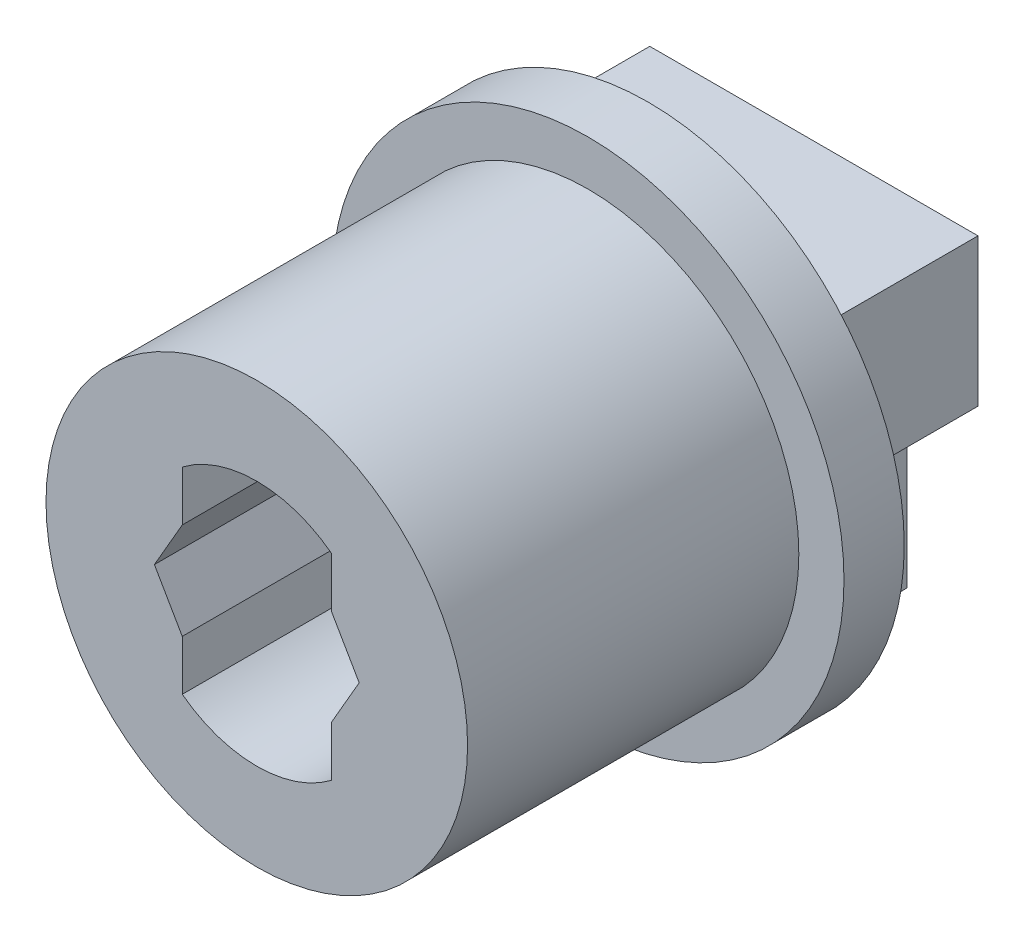
ISO-10303-21;
HEADER;
FILE_DESCRIPTION(('STEP AP214'),'2;1');
FILE_NAME('part.step','',(''),(''),'','','');
FILE_SCHEMA(('AUTOMOTIVE_DESIGN { 1 0 10303 214 1 1 1 1 }'));
ENDSEC;
DATA;
#1=APPLICATION_CONTEXT('core data for automotive mechanical design processes');
#2=APPLICATION_PROTOCOL_DEFINITION('international standard','automotive_design',2000,#1);
#3=PRODUCT_CONTEXT('',#1,'mechanical');
#4=PRODUCT('Part','Part','',(#3));
#5=PRODUCT_RELATED_PRODUCT_CATEGORY('part','',(#4));
#6=PRODUCT_DEFINITION_FORMATION('','',#4);
#7=PRODUCT_DEFINITION_CONTEXT('part definition',#1,'design');
#8=PRODUCT_DEFINITION('design','',#6,#7);
#9=PRODUCT_DEFINITION_SHAPE('','',#8);
#10=(LENGTH_UNIT() NAMED_UNIT(*) SI_UNIT(.MILLI.,.METRE.));
#11=(NAMED_UNIT(*) PLANE_ANGLE_UNIT() SI_UNIT($,.RADIAN.));
#12=(NAMED_UNIT(*) SI_UNIT($,.STERADIAN.) SOLID_ANGLE_UNIT());
#13=UNCERTAINTY_MEASURE_WITH_UNIT(LENGTH_MEASURE(1.E-05),#10,'distance_accuracy_value','');
#14=(GEOMETRIC_REPRESENTATION_CONTEXT(3) GLOBAL_UNCERTAINTY_ASSIGNED_CONTEXT((#13)) GLOBAL_UNIT_ASSIGNED_CONTEXT((#10,
#11,#12)) REPRESENTATION_CONTEXT('',''));
#15=CARTESIAN_POINT('',(0.,0.,0.));
#16=DIRECTION('',(0.,0.,1.));
#17=DIRECTION('',(1.,0.,0.));
#18=AXIS2_PLACEMENT_3D('',#15,#16,#17);
#19=CARTESIAN_POINT('',(-14.5592,-4.1492,0.));
#20=DIRECTION('',(0.,0.,-1.));
#21=DIRECTION('',(-1.,0.,0.));
#22=AXIS2_PLACEMENT_3D('',#19,#20,#21);
#23=PLANE('',#22);
#24=CARTESIAN_POINT('',(-18.,0.,0.));
#25=DIRECTION('',(0.,0.,1.));
#26=DIRECTION('',(1.,0.,0.));
#27=AXIS2_PLACEMENT_3D('',#24,#25,#26);
#28=CIRCLE('',#27,8.5);
#29=CARTESIAN_POINT('',(-9.5,0.,0.));
#30=VERTEX_POINT('',#29);
#31=EDGE_CURVE('E309',#30,#30,#28,.T.);
#32=ORIENTED_EDGE('',*,*,#31,.T.);
#33=EDGE_LOOP('',(#32));
#34=FACE_BOUND('',#33,.T.);
#35=CARTESIAN_POINT('',(-17.9999999993386,-1.27777996516976E-10,0.));
#36=DIRECTION('',(0.,0.,-1.));
#37=DIRECTION('',(-1.,0.,0.));
#38=AXIS2_PLACEMENT_3D('',#35,#36,#37);
#39=CIRCLE('',#38,7.00000000066145);
#40=CARTESIAN_POINT('',(-25.,-1.27777996516976E-10,0.));
#41=VERTEX_POINT('',#40);
#42=EDGE_CURVE('E11',#41,#41,#39,.F.);
#43=ORIENTED_EDGE('',*,*,#42,.F.);
#44=EDGE_LOOP('',(#43));
#45=FACE_BOUND('',#44,.T.);
#46=ADVANCED_FACE('F36',(#34,#45),#23,.F.);
#47=CARTESIAN_POINT('',(-9.398,-8.602,-2.));
#48=DIRECTION('',(0.,0.,-1.));
#49=DIRECTION('',(-1.,0.,0.));
#50=AXIS2_PLACEMENT_3D('',#47,#48,#49);
#51=PLANE('',#50);
#52=CARTESIAN_POINT('',(-18.,0.,-2.));
#53=DIRECTION('',(0.,0.,1.));
#54=DIRECTION('',(1.,0.,0.));
#55=AXIS2_PLACEMENT_3D('',#52,#53,#54);
#56=CIRCLE('',#55,8.5);
#57=CARTESIAN_POINT('',(-9.5,0.,-2.));
#58=VERTEX_POINT('',#57);
#59=EDGE_CURVE('E44',#58,#58,#56,.F.);
#60=ORIENTED_EDGE('',*,*,#59,.T.);
#61=EDGE_LOOP('',(#60));
#62=FACE_BOUND('',#61,.T.);
#63=DIRECTION('',(1.,0.,0.));
#64=VECTOR('',#63,1.);
#65=CARTESIAN_POINT('',(-12.549999998012,4.629434044448,-2.));
#66=LINE('',#65,#64);
#67=CARTESIAN_POINT('',(-23.450000000994,4.629434044448,-2.));
#68=VERTEX_POINT('',#67);
#69=CARTESIAN_POINT('',(-12.549999998012,4.629434044448,-2.));
#70=VERTEX_POINT('',#69);
#71=EDGE_CURVE('E276',#68,#70,#66,.T.);
#72=ORIENTED_EDGE('',*,*,#71,.F.);
#73=DIRECTION('',(0.,1.,0.));
#74=VECTOR('',#73,1.);
#75=CARTESIAN_POINT('',(-23.450000000994,4.629434044448,-2.));
#76=LINE('',#75,#74);
#77=CARTESIAN_POINT('',(-23.450000000994,-0.270565961522,-2.));
#78=VERTEX_POINT('',#77);
#79=EDGE_CURVE('E254',#78,#68,#76,.T.);
#80=ORIENTED_EDGE('',*,*,#79,.F.);
#81=DIRECTION('',(-1.,0.,0.));
#82=VECTOR('',#81,1.);
#83=CARTESIAN_POINT('',(-23.450000000994,-0.270565961522,-2.));
#84=LINE('',#83,#82);
#85=CARTESIAN_POINT('',(-21.099999998553,-0.270565961521999,-2.));
#86=VERTEX_POINT('',#85);
#87=EDGE_CURVE('E259',#86,#78,#84,.T.);
#88=ORIENTED_EDGE('',*,*,#87,.F.);
#89=DIRECTION('',(0.,1.,0.));
#90=VECTOR('',#89,1.);
#91=CARTESIAN_POINT('',(-21.099999998553,-0.270565961521999,-2.));
#92=LINE('',#91,#90);
#93=CARTESIAN_POINT('',(-21.099999998553,-6.670565961032,-2.));
#94=VERTEX_POINT('',#93);
#95=EDGE_CURVE('E286',#94,#86,#92,.T.);
#96=ORIENTED_EDGE('',*,*,#95,.F.);
#97=DIRECTION('',(-1.,0.,0.));
#98=VECTOR('',#97,1.);
#99=CARTESIAN_POINT('',(-21.099999998553,-6.670565961032,-2.));
#100=LINE('',#99,#98);
#101=CARTESIAN_POINT('',(-14.900000001447,-6.670565961032,-2.));
#102=VERTEX_POINT('',#101);
#103=EDGE_CURVE('E284',#102,#94,#100,.T.);
#104=ORIENTED_EDGE('',*,*,#103,.F.);
#105=DIRECTION('',(0.,-1.,0.));
#106=VECTOR('',#105,1.);
#107=CARTESIAN_POINT('',(-14.900000001447,-6.670565961032,-2.));
#108=LINE('',#107,#106);
#109=CARTESIAN_POINT('',(-14.900000001447,-0.270565961522,-2.));
#110=VERTEX_POINT('',#109);
#111=EDGE_CURVE('E282',#110,#102,#108,.T.);
#112=ORIENTED_EDGE('',*,*,#111,.F.);
#113=DIRECTION('',(-1.,0.,0.));
#114=VECTOR('',#113,1.);
#115=CARTESIAN_POINT('',(-14.900000001447,-0.270565961522,-2.));
#116=LINE('',#115,#114);
#117=CARTESIAN_POINT('',(-12.549999998012,-0.270565961522,-2.));
#118=VERTEX_POINT('',#117);
#119=EDGE_CURVE('E280',#118,#110,#116,.T.);
#120=ORIENTED_EDGE('',*,*,#119,.F.);
#121=DIRECTION('',(0.,-1.,0.));
#122=VECTOR('',#121,1.);
#123=CARTESIAN_POINT('',(-12.549999998012,-0.270565961522,-2.));
#124=LINE('',#123,#122);
#125=EDGE_CURVE('E278',#70,#118,#124,.T.);
#126=ORIENTED_EDGE('',*,*,#125,.F.);
#127=EDGE_LOOP('',(#72,#80,#88,#96,#104,#112,#120,#126));
#128=FACE_BOUND('',#127,.T.);
#129=ADVANCED_FACE('F324',(#62,#128),#51,.T.);
#130=CARTESIAN_POINT('',(-18.,0.,-2.));
#131=DIRECTION('',(0.,0.,1.));
#132=DIRECTION('',(1.,0.,0.));
#133=AXIS2_PLACEMENT_3D('',#130,#131,#132);
#134=CYLINDRICAL_SURFACE('',#133,8.5);
#135=ORIENTED_EDGE('',*,*,#31,.F.);
#136=EDGE_LOOP('',(#135));
#137=FACE_BOUND('',#136,.T.);
#138=ORIENTED_EDGE('',*,*,#59,.F.);
#139=EDGE_LOOP('',(#138));
#140=FACE_BOUND('',#139,.T.);
#141=ADVANCED_FACE('F321',(#137,#140),#134,.T.);
#142=DIRECTION('',(0.,-1.,0.));
#143=VECTOR('',#142,1.);
#144=CARTESIAN_POINT('',(-20.475,-1.602146995724,0.));
#145=LINE('',#144,#143);
#146=CARTESIAN_POINT('',(-20.475,-1.602146995724,0.));
#147=VERTEX_POINT('',#146);
#148=CARTESIAN_POINT('',(-20.475,-3.26869622289395,0.));
#149=VERTEX_POINT('',#148);
#150=EDGE_CURVE('E172',#147,#149,#145,.T.);
#151=ORIENTED_EDGE('',*,*,#150,.T.);
#152=CARTESIAN_POINT('',(-17.9999999993386,-1.27777996516976E-10,0.));
#153=DIRECTION('',(0.,0.,1.));
#154=DIRECTION('',(1.,0.,0.));
#155=AXIS2_PLACEMENT_3D('',#152,#153,#154);
#156=CIRCLE('',#155,4.1);
#157=CARTESIAN_POINT('',(-15.5249999991788,-3.2686962232738,0.));
#158=VERTEX_POINT('',#157);
#159=EDGE_CURVE('E204',#149,#158,#156,.T.);
#160=ORIENTED_EDGE('',*,*,#159,.T.);
#161=DIRECTION('',(0.,1.,0.));
#162=VECTOR('',#161,1.);
#163=CARTESIAN_POINT('',(-15.5249999991788,-3.2686962232738,0.));
#164=LINE('',#163,#162);
#165=CARTESIAN_POINT('',(-15.5249999991788,-1.60214699517567,0.));
#166=VERTEX_POINT('',#165);
#167=EDGE_CURVE('E178',#158,#166,#164,.T.);
#168=ORIENTED_EDGE('',*,*,#167,.T.);
#169=DIRECTION('',(0.5,0.866025403784439,0.));
#170=VECTOR('',#169,1.);
#171=CARTESIAN_POINT('',(-15.5249999991788,-1.60214699517567,0.));
#172=LINE('',#171,#170);
#173=CARTESIAN_POINT('',(-14.5999999984554,3.07850450836688E-09,0.));
#174=VERTEX_POINT('',#173);
#175=EDGE_CURVE('E207',#166,#174,#172,.T.);
#176=ORIENTED_EDGE('',*,*,#175,.T.);
#177=DIRECTION('',(-0.500000001641344,0.866025402836808,0.));
#178=VECTOR('',#177,1.);
#179=CARTESIAN_POINT('',(-14.5999999984554,3.07850450836688E-09,0.));
#180=LINE('',#179,#178);
#181=CARTESIAN_POINT('',(-15.5249999991788,1.60214699432022,0.));
#182=VERTEX_POINT('',#181);
#183=EDGE_CURVE('E210',#174,#182,#180,.T.);
#184=ORIENTED_EDGE('',*,*,#183,.T.);
#185=DIRECTION('',(0.,1.,0.));
#186=VECTOR('',#185,1.);
#187=CARTESIAN_POINT('',(-15.5249999991788,1.60214699432022,0.));
#188=LINE('',#187,#186);
#189=CARTESIAN_POINT('',(-15.5249999991788,3.26869622301824,0.));
#190=VERTEX_POINT('',#189);
#191=EDGE_CURVE('E213',#182,#190,#188,.T.);
#192=ORIENTED_EDGE('',*,*,#191,.T.);
#193=CARTESIAN_POINT('',(-17.9999999993386,-1.27777996516976E-10,0.));
#194=DIRECTION('',(0.,0.,1.));
#195=DIRECTION('',(1.,0.,0.));
#196=AXIS2_PLACEMENT_3D('',#193,#194,#195);
#197=CIRCLE('',#196,4.1);
#198=CARTESIAN_POINT('',(-20.475,3.2686962226384,0.));
#199=VERTEX_POINT('',#198);
#200=EDGE_CURVE('E216',#190,#199,#197,.T.);
#201=ORIENTED_EDGE('',*,*,#200,.T.);
#202=DIRECTION('',(0.,-1.,0.));
#203=VECTOR('',#202,1.);
#204=CARTESIAN_POINT('',(-20.475,3.2686962226384,0.));
#205=LINE('',#204,#203);
#206=CARTESIAN_POINT('',(-20.475,1.60214699504789,0.));
#207=VERTEX_POINT('',#206);
#208=EDGE_CURVE('E219',#199,#207,#205,.T.);
#209=ORIENTED_EDGE('',*,*,#208,.T.);
#210=DIRECTION('',(-0.499999999557327,-0.866025404040016,0.));
#211=VECTOR('',#210,1.);
#212=CARTESIAN_POINT('',(-20.475,1.60214699504789,0.));
#213=LINE('',#212,#211);
#214=CARTESIAN_POINT('',(-21.3999999985215,-1.28368837911882E-09,0.));
#215=VERTEX_POINT('',#214);
#216=EDGE_CURVE('E222',#207,#215,#213,.T.);
#217=ORIENTED_EDGE('',*,*,#216,.T.);
#218=DIRECTION('',(0.5,-0.866025403784439,0.));
#219=VECTOR('',#218,1.);
#220=CARTESIAN_POINT('',(-21.3999999985215,-1.28368837911882E-09,0.));
#221=LINE('',#220,#219);
#222=EDGE_CURVE('E225',#215,#147,#221,.T.);
#223=ORIENTED_EDGE('',*,*,#222,.T.);
#224=EDGE_LOOP('',(#151,#160,#168,#176,#184,#192,#201,#209,#217,#223));
#225=FACE_BOUND('',#224,.T.);
#226=CARTESIAN_POINT('',(-18.,0.,0.));
#227=DIRECTION('',(0.,0.,1.));
#228=DIRECTION('',(1.,0.,0.));
#229=AXIS2_PLACEMENT_3D('',#226,#227,#228);
#230=CIRCLE('',#229,1.89999999999999);
#231=CARTESIAN_POINT('',(-16.1,0.,0.));
#232=VERTEX_POINT('',#231);
#233=EDGE_CURVE('E248',#232,#232,#230,.T.);
#234=ORIENTED_EDGE('',*,*,#233,.F.);
#235=EDGE_LOOP('',(#234));
#236=FACE_BOUND('',#235,.T.);
#237=ADVANCED_FACE('F38',(#225,#236),#23,.F.);
#238=CARTESIAN_POINT('',(-23.450000000994,4.629434044448,-7.5));
#239=DIRECTION('',(1.,0.,0.));
#240=DIRECTION('',(0.,0.,-1.));
#241=AXIS2_PLACEMENT_3D('',#238,#239,#240);
#242=PLANE('',#241);
#243=ORIENTED_EDGE('',*,*,#79,.T.);
#244=DIRECTION('',(0.,0.,1.));
#245=VECTOR('',#244,1.);
#246=CARTESIAN_POINT('',(-23.450000000994,4.629434044448,-7.5));
#247=LINE('',#246,#245);
#248=CARTESIAN_POINT('',(-23.450000000994,4.629434044448,-7.5));
#249=VERTEX_POINT('',#248);
#250=EDGE_CURVE('E307',#249,#68,#247,.T.);
#251=ORIENTED_EDGE('',*,*,#250,.F.);
#252=DIRECTION('',(0.,1.,0.));
#253=VECTOR('',#252,1.);
#254=CARTESIAN_POINT('',(-23.450000000994,4.629434044448,-7.5));
#255=LINE('',#254,#253);
#256=CARTESIAN_POINT('',(-23.450000000994,-0.270565961522,-7.5));
#257=VERTEX_POINT('',#256);
#258=EDGE_CURVE('E255',#257,#249,#255,.T.);
#259=ORIENTED_EDGE('',*,*,#258,.F.);
#260=DIRECTION('',(0.,0.,1.));
#261=VECTOR('',#260,1.);
#262=CARTESIAN_POINT('',(-23.450000000994,-0.270565961522,-7.5));
#263=LINE('',#262,#261);
#264=EDGE_CURVE('E273',#257,#78,#263,.T.);
#265=ORIENTED_EDGE('',*,*,#264,.T.);
#266=EDGE_LOOP('',(#243,#251,#259,#265));
#267=FACE_BOUND('',#266,.T.);
#268=ADVANCED_FACE('F326',(#267),#242,.F.);
#269=CARTESIAN_POINT('',(-12.549999998012,4.629434044448,-7.5));
#270=DIRECTION('',(0.,-1.,0.));
#271=DIRECTION('',(0.,0.,-1.));
#272=AXIS2_PLACEMENT_3D('',#269,#270,#271);
#273=PLANE('',#272);
#274=ORIENTED_EDGE('',*,*,#71,.T.);
#275=DIRECTION('',(0.,0.,1.));
#276=VECTOR('',#275,1.);
#277=CARTESIAN_POINT('',(-12.549999998012,4.629434044448,-7.5));
#278=LINE('',#277,#276);
#279=CARTESIAN_POINT('',(-12.549999998012,4.629434044448,-7.5));
#280=VERTEX_POINT('',#279);
#281=EDGE_CURVE('E304',#280,#70,#278,.T.);
#282=ORIENTED_EDGE('',*,*,#281,.F.);
#283=DIRECTION('',(1.,0.,0.));
#284=VECTOR('',#283,1.);
#285=CARTESIAN_POINT('',(-12.549999998012,4.629434044448,-7.5));
#286=LINE('',#285,#284);
#287=EDGE_CURVE('E258',#249,#280,#286,.T.);
#288=ORIENTED_EDGE('',*,*,#287,.F.);
#289=ORIENTED_EDGE('',*,*,#250,.T.);
#290=EDGE_LOOP('',(#274,#282,#288,#289));
#291=FACE_BOUND('',#290,.T.);
#292=ADVANCED_FACE('F338',(#291),#273,.F.);
#293=CARTESIAN_POINT('',(-12.549999998012,-0.270565961522,-7.5));
#294=DIRECTION('',(-1.,0.,0.));
#295=DIRECTION('',(0.,0.,1.));
#296=AXIS2_PLACEMENT_3D('',#293,#294,#295);
#297=PLANE('',#296);
#298=ORIENTED_EDGE('',*,*,#125,.T.);
#299=DIRECTION('',(0.,0.,1.));
#300=VECTOR('',#299,1.);
#301=CARTESIAN_POINT('',(-12.549999998012,-0.270565961522,-7.5));
#302=LINE('',#301,#300);
#303=CARTESIAN_POINT('',(-12.549999998012,-0.270565961522,-7.5));
#304=VERTEX_POINT('',#303);
#305=EDGE_CURVE('E301',#304,#118,#302,.T.);
#306=ORIENTED_EDGE('',*,*,#305,.F.);
#307=DIRECTION('',(0.,-1.,0.));
#308=VECTOR('',#307,1.);
#309=CARTESIAN_POINT('',(-12.549999998012,-0.270565961522,-7.5));
#310=LINE('',#309,#308);
#311=EDGE_CURVE('E261',#280,#304,#310,.T.);
#312=ORIENTED_EDGE('',*,*,#311,.F.);
#313=ORIENTED_EDGE('',*,*,#281,.T.);
#314=EDGE_LOOP('',(#298,#306,#312,#313));
#315=FACE_BOUND('',#314,.T.);
#316=ADVANCED_FACE('F342',(#315),#297,.F.);
#317=CARTESIAN_POINT('',(-14.900000001447,-0.270565961522,-7.5));
#318=DIRECTION('',(0.,1.,0.));
#319=DIRECTION('',(-1.,0.,0.));
#320=AXIS2_PLACEMENT_3D('',#317,#318,#319);
#321=PLANE('',#320);
#322=ORIENTED_EDGE('',*,*,#119,.T.);
#323=DIRECTION('',(0.,0.,1.));
#324=VECTOR('',#323,1.);
#325=CARTESIAN_POINT('',(-14.900000001447,-0.270565961522,-7.5));
#326=LINE('',#325,#324);
#327=CARTESIAN_POINT('',(-14.900000001447,-0.270565961522,-7.5));
#328=VERTEX_POINT('',#327);
#329=EDGE_CURVE('E298',#328,#110,#326,.T.);
#330=ORIENTED_EDGE('',*,*,#329,.F.);
#331=DIRECTION('',(-1.,0.,0.));
#332=VECTOR('',#331,1.);
#333=CARTESIAN_POINT('',(-14.900000001447,-0.270565961522,-7.5));
#334=LINE('',#333,#332);
#335=EDGE_CURVE('E263',#304,#328,#334,.T.);
#336=ORIENTED_EDGE('',*,*,#335,.F.);
#337=ORIENTED_EDGE('',*,*,#305,.T.);
#338=EDGE_LOOP('',(#322,#330,#336,#337));
#339=FACE_BOUND('',#338,.T.);
#340=ADVANCED_FACE('F367',(#339),#321,.F.);
#341=CARTESIAN_POINT('',(-14.900000001447,-6.670565961032,-7.5));
#342=DIRECTION('',(-1.,0.,0.));
#343=DIRECTION('',(0.,0.,1.));
#344=AXIS2_PLACEMENT_3D('',#341,#342,#343);
#345=PLANE('',#344);
#346=ORIENTED_EDGE('',*,*,#111,.T.);
#347=DIRECTION('',(0.,0.,1.));
#348=VECTOR('',#347,1.);
#349=CARTESIAN_POINT('',(-14.900000001447,-6.670565961032,-7.5));
#350=LINE('',#349,#348);
#351=CARTESIAN_POINT('',(-14.900000001447,-6.670565961032,-7.5));
#352=VERTEX_POINT('',#351);
#353=EDGE_CURVE('E295',#352,#102,#350,.T.);
#354=ORIENTED_EDGE('',*,*,#353,.F.);
#355=DIRECTION('',(0.,-1.,0.));
#356=VECTOR('',#355,1.);
#357=CARTESIAN_POINT('',(-14.900000001447,-6.670565961032,-7.5));
#358=LINE('',#357,#356);
#359=EDGE_CURVE('E265',#328,#352,#358,.T.);
#360=ORIENTED_EDGE('',*,*,#359,.F.);
#361=ORIENTED_EDGE('',*,*,#329,.T.);
#362=EDGE_LOOP('',(#346,#354,#360,#361));
#363=FACE_BOUND('',#362,.T.);
#364=ADVANCED_FACE('F365',(#363),#345,.F.);
#365=CARTESIAN_POINT('',(-21.099999998553,-6.670565961032,-7.5));
#366=DIRECTION('',(0.,1.,0.));
#367=DIRECTION('',(0.,0.,1.));
#368=AXIS2_PLACEMENT_3D('',#365,#366,#367);
#369=PLANE('',#368);
#370=ORIENTED_EDGE('',*,*,#103,.T.);
#371=DIRECTION('',(0.,0.,1.));
#372=VECTOR('',#371,1.);
#373=CARTESIAN_POINT('',(-21.099999998553,-6.670565961032,-7.5));
#374=LINE('',#373,#372);
#375=CARTESIAN_POINT('',(-21.099999998553,-6.670565961032,-7.5));
#376=VERTEX_POINT('',#375);
#377=EDGE_CURVE('E292',#376,#94,#374,.T.);
#378=ORIENTED_EDGE('',*,*,#377,.F.);
#379=DIRECTION('',(-1.,0.,0.));
#380=VECTOR('',#379,1.);
#381=CARTESIAN_POINT('',(-21.099999998553,-6.670565961032,-7.5));
#382=LINE('',#381,#380);
#383=EDGE_CURVE('E267',#352,#376,#382,.T.);
#384=ORIENTED_EDGE('',*,*,#383,.F.);
#385=ORIENTED_EDGE('',*,*,#353,.T.);
#386=EDGE_LOOP('',(#370,#378,#384,#385));
#387=FACE_BOUND('',#386,.T.);
#388=ADVANCED_FACE('F361',(#387),#369,.F.);
#389=CARTESIAN_POINT('',(-21.099999998553,-0.270565961521999,-7.5));
#390=DIRECTION('',(1.,0.,0.));
#391=DIRECTION('',(0.,0.,-1.));
#392=AXIS2_PLACEMENT_3D('',#389,#390,#391);
#393=PLANE('',#392);
#394=ORIENTED_EDGE('',*,*,#95,.T.);
#395=DIRECTION('',(0.,0.,1.));
#396=VECTOR('',#395,1.);
#397=CARTESIAN_POINT('',(-21.099999998553,-0.270565961521999,-7.5));
#398=LINE('',#397,#396);
#399=CARTESIAN_POINT('',(-21.099999998553,-0.270565961521999,-7.5));
#400=VERTEX_POINT('',#399);
#401=EDGE_CURVE('E59',#400,#86,#398,.T.);
#402=ORIENTED_EDGE('',*,*,#401,.F.);
#403=DIRECTION('',(0.,1.,0.));
#404=VECTOR('',#403,1.);
#405=CARTESIAN_POINT('',(-21.099999998553,-0.270565961521999,-7.5));
#406=LINE('',#405,#404);
#407=EDGE_CURVE('E269',#376,#400,#406,.T.);
#408=ORIENTED_EDGE('',*,*,#407,.F.);
#409=ORIENTED_EDGE('',*,*,#377,.T.);
#410=EDGE_LOOP('',(#394,#402,#408,#409));
#411=FACE_BOUND('',#410,.T.);
#412=ADVANCED_FACE('F356',(#411),#393,.F.);
#413=CARTESIAN_POINT('',(-23.450000000994,-0.270565961522,-7.5));
#414=DIRECTION('',(0.,1.,0.));
#415=DIRECTION('',(-1.,0.,0.));
#416=AXIS2_PLACEMENT_3D('',#413,#414,#415);
#417=PLANE('',#416);
#418=ORIENTED_EDGE('',*,*,#87,.T.);
#419=ORIENTED_EDGE('',*,*,#264,.F.);
#420=DIRECTION('',(-1.,0.,0.));
#421=VECTOR('',#420,1.);
#422=CARTESIAN_POINT('',(-23.450000000994,-0.270565961522,-7.5));
#423=LINE('',#422,#421);
#424=EDGE_CURVE('E271',#400,#257,#423,.T.);
#425=ORIENTED_EDGE('',*,*,#424,.F.);
#426=ORIENTED_EDGE('',*,*,#401,.T.);
#427=EDGE_LOOP('',(#418,#419,#425,#426));
#428=FACE_BOUND('',#427,.T.);
#429=ADVANCED_FACE('F351',(#428),#417,.F.);
#430=CARTESIAN_POINT('',(0.,0.,-7.5));
#431=DIRECTION('',(0.,0.,1.));
#432=DIRECTION('',(1.,0.,0.));
#433=AXIS2_PLACEMENT_3D('',#430,#431,#432);
#434=PLANE('',#433);
#435=CARTESIAN_POINT('',(-18.,0.,-7.50000000000001));
#436=DIRECTION('',(0.,0.,1.));
#437=DIRECTION('',(1.,0.,0.));
#438=AXIS2_PLACEMENT_3D('',#435,#436,#437);
#439=CIRCLE('',#438,1.89999999999998);
#440=CARTESIAN_POINT('',(-16.1,0.,-7.50000000000001));
#441=VERTEX_POINT('',#440);
#442=EDGE_CURVE('E251',#441,#441,#439,.T.);
#443=ORIENTED_EDGE('',*,*,#442,.T.);
#444=EDGE_LOOP('',(#443));
#445=FACE_BOUND('',#444,.T.);
#446=ORIENTED_EDGE('',*,*,#258,.T.);
#447=ORIENTED_EDGE('',*,*,#287,.T.);
#448=ORIENTED_EDGE('',*,*,#311,.T.);
#449=ORIENTED_EDGE('',*,*,#335,.T.);
#450=ORIENTED_EDGE('',*,*,#359,.T.);
#451=ORIENTED_EDGE('',*,*,#383,.T.);
#452=ORIENTED_EDGE('',*,*,#407,.T.);
#453=ORIENTED_EDGE('',*,*,#424,.T.);
#454=EDGE_LOOP('',(#446,#447,#448,#449,#450,#451,#452,#453));
#455=FACE_BOUND('',#454,.T.);
#456=ADVANCED_FACE('F346',(#445,#455),#434,.F.);
#457=CARTESIAN_POINT('',(-18.,0.,0.));
#458=DIRECTION('',(0.,0.,1.));
#459=DIRECTION('',(1.,0.,0.));
#460=AXIS2_PLACEMENT_3D('',#457,#458,#459);
#461=CYLINDRICAL_SURFACE('',#460,1.89999999999998);
#462=ORIENTED_EDGE('',*,*,#442,.F.);
#463=EDGE_LOOP('',(#462));
#464=FACE_BOUND('',#463,.T.);
#465=ORIENTED_EDGE('',*,*,#233,.T.);
#466=EDGE_LOOP('',(#465));
#467=FACE_BOUND('',#466,.T.);
#468=ADVANCED_FACE('F388',(#464,#467),#461,.F.);
#469=CARTESIAN_POINT('',(-17.9999999993386,-1.27777996516976E-10,11.));
#470=DIRECTION('',(0.,0.,1.));
#471=DIRECTION('',(1.,0.,0.));
#472=AXIS2_PLACEMENT_3D('',#469,#470,#471);
#473=PLANE('',#472);
#474=CARTESIAN_POINT('',(-17.9999999993386,-1.27777996516976E-10,11.));
#475=DIRECTION('',(0.,0.,1.));
#476=DIRECTION('',(1.,0.,0.));
#477=AXIS2_PLACEMENT_3D('',#474,#475,#476);
#478=CIRCLE('',#477,7.00000000066145);
#479=CARTESIAN_POINT('',(-10.9999999986771,-1.27777996516976E-10,11.));
#480=VERTEX_POINT('',#479);
#481=EDGE_CURVE('E179',#480,#480,#478,.T.);
#482=ORIENTED_EDGE('',*,*,#481,.T.);
#483=EDGE_LOOP('',(#482));
#484=FACE_BOUND('',#483,.T.);
#485=DIRECTION('',(0.,1.,0.));
#486=VECTOR('',#485,1.);
#487=CARTESIAN_POINT('',(-15.5249999991788,-3.2686962232738,11.));
#488=LINE('',#487,#486);
#489=CARTESIAN_POINT('',(-15.5249999991788,-3.2686962232738,11.));
#490=VERTEX_POINT('',#489);
#491=CARTESIAN_POINT('',(-15.5249999991788,-1.60214699517567,11.));
#492=VERTEX_POINT('',#491);
#493=EDGE_CURVE('E171',#490,#492,#488,.T.);
#494=ORIENTED_EDGE('',*,*,#493,.F.);
#495=CARTESIAN_POINT('',(-17.9999999993386,-1.27777996516976E-10,11.));
#496=DIRECTION('',(0.,0.,1.));
#497=DIRECTION('',(1.,0.,0.));
#498=AXIS2_PLACEMENT_3D('',#495,#496,#497);
#499=CIRCLE('',#498,4.1);
#500=CARTESIAN_POINT('',(-20.475,-3.26869622289395,11.));
#501=VERTEX_POINT('',#500);
#502=EDGE_CURVE('E163',#501,#490,#499,.T.);
#503=ORIENTED_EDGE('',*,*,#502,.F.);
#504=DIRECTION('',(0.,-1.,0.));
#505=VECTOR('',#504,1.);
#506=CARTESIAN_POINT('',(-20.475,-1.602146995724,11.));
#507=LINE('',#506,#505);
#508=CARTESIAN_POINT('',(-20.475,-1.602146995724,11.));
#509=VERTEX_POINT('',#508);
#510=EDGE_CURVE('E202',#509,#501,#507,.T.);
#511=ORIENTED_EDGE('',*,*,#510,.F.);
#512=DIRECTION('',(0.5,-0.866025403784439,0.));
#513=VECTOR('',#512,1.);
#514=CARTESIAN_POINT('',(-21.3999999985215,-1.28368837911882E-09,11.));
#515=LINE('',#514,#513);
#516=CARTESIAN_POINT('',(-21.3999999985215,-1.28368837911882E-09,11.));
#517=VERTEX_POINT('',#516);
#518=EDGE_CURVE('E199',#517,#509,#515,.T.);
#519=ORIENTED_EDGE('',*,*,#518,.F.);
#520=DIRECTION('',(-0.499999999557327,-0.866025404040016,0.));
#521=VECTOR('',#520,1.);
#522=CARTESIAN_POINT('',(-20.475,1.60214699504789,11.));
#523=LINE('',#522,#521);
#524=CARTESIAN_POINT('',(-20.475,1.60214699504789,11.));
#525=VERTEX_POINT('',#524);
#526=EDGE_CURVE('E197',#525,#517,#523,.T.);
#527=ORIENTED_EDGE('',*,*,#526,.F.);
#528=DIRECTION('',(0.,-1.,0.));
#529=VECTOR('',#528,1.);
#530=CARTESIAN_POINT('',(-20.475,3.2686962226384,11.));
#531=LINE('',#530,#529);
#532=CARTESIAN_POINT('',(-20.475,3.2686962226384,11.));
#533=VERTEX_POINT('',#532);
#534=EDGE_CURVE('E195',#533,#525,#531,.T.);
#535=ORIENTED_EDGE('',*,*,#534,.F.);
#536=CARTESIAN_POINT('',(-17.9999999993386,-1.27777996516976E-10,11.));
#537=DIRECTION('',(0.,0.,1.));
#538=DIRECTION('',(1.,0.,0.));
#539=AXIS2_PLACEMENT_3D('',#536,#537,#538);
#540=CIRCLE('',#539,4.1);
#541=CARTESIAN_POINT('',(-15.5249999991788,3.26869622301824,11.));
#542=VERTEX_POINT('',#541);
#543=EDGE_CURVE('E193',#542,#533,#540,.T.);
#544=ORIENTED_EDGE('',*,*,#543,.F.);
#545=DIRECTION('',(0.,1.,0.));
#546=VECTOR('',#545,1.);
#547=CARTESIAN_POINT('',(-15.5249999991788,1.60214699432022,11.));
#548=LINE('',#547,#546);
#549=CARTESIAN_POINT('',(-15.5249999991788,1.60214699432022,11.));
#550=VERTEX_POINT('',#549);
#551=EDGE_CURVE('E191',#550,#542,#548,.T.);
#552=ORIENTED_EDGE('',*,*,#551,.F.);
#553=DIRECTION('',(-0.500000001641344,0.866025402836808,0.));
#554=VECTOR('',#553,1.);
#555=CARTESIAN_POINT('',(-14.5999999984554,3.07850450836688E-09,11.));
#556=LINE('',#555,#554);
#557=CARTESIAN_POINT('',(-14.5999999984554,3.07850450836688E-09,11.));
#558=VERTEX_POINT('',#557);
#559=EDGE_CURVE('E187',#558,#550,#556,.T.);
#560=ORIENTED_EDGE('',*,*,#559,.F.);
#561=DIRECTION('',(0.5,0.866025403784439,0.));
#562=VECTOR('',#561,1.);
#563=CARTESIAN_POINT('',(-15.5249999991788,-1.60214699517567,11.));
#564=LINE('',#563,#562);
#565=EDGE_CURVE('E185',#492,#558,#564,.T.);
#566=ORIENTED_EDGE('',*,*,#565,.F.);
#567=EDGE_LOOP('',(#494,#503,#511,#519,#527,#535,#544,#552,#560,#566));
#568=FACE_BOUND('',#567,.T.);
#569=ADVANCED_FACE('F183',(#484,#568),#473,.T.);
#570=CARTESIAN_POINT('',(-17.9999999993386,-1.27777996516976E-10,11.));
#571=DIRECTION('',(0.,0.,-1.));
#572=DIRECTION('',(-1.,0.,0.));
#573=AXIS2_PLACEMENT_3D('',#570,#571,#572);
#574=CYLINDRICAL_SURFACE('',#573,7.00000000066145);
#575=ORIENTED_EDGE('',*,*,#481,.F.);
#576=EDGE_LOOP('',(#575));
#577=FACE_BOUND('',#576,.T.);
#578=ORIENTED_EDGE('',*,*,#42,.T.);
#579=EDGE_LOOP('',(#578));
#580=FACE_BOUND('',#579,.T.);
#581=ADVANCED_FACE('F396',(#577,#580),#574,.T.);
#582=CARTESIAN_POINT('',(-17.9999999993386,-1.27777996516976E-10,11.));
#583=DIRECTION('',(0.,0.,-1.));
#584=DIRECTION('',(-1.,0.,0.));
#585=AXIS2_PLACEMENT_3D('',#582,#583,#584);
#586=CYLINDRICAL_SURFACE('',#585,4.1);
#587=ORIENTED_EDGE('',*,*,#159,.F.);
#588=DIRECTION('',(0.,0.,-1.));
#589=VECTOR('',#588,1.);
#590=CARTESIAN_POINT('',(-20.475,-3.26869622289395,11.));
#591=LINE('',#590,#589);
#592=EDGE_CURVE('E51',#501,#149,#591,.T.);
#593=ORIENTED_EDGE('',*,*,#592,.F.);
#594=ORIENTED_EDGE('',*,*,#502,.T.);
#595=DIRECTION('',(0.,0.,-1.));
#596=VECTOR('',#595,1.);
#597=CARTESIAN_POINT('',(-15.5249999991788,-3.2686962232738,11.));
#598=LINE('',#597,#596);
#599=EDGE_CURVE('E166',#490,#158,#598,.T.);
#600=ORIENTED_EDGE('',*,*,#599,.T.);
#601=EDGE_LOOP('',(#587,#593,#594,#600));
#602=FACE_BOUND('',#601,.T.);
#603=ADVANCED_FACE('F165',(#602),#586,.F.);
#604=CARTESIAN_POINT('',(-15.5249999991788,-3.2686962232738,11.));
#605=DIRECTION('',(-1.,0.,0.));
#606=DIRECTION('',(0.,0.,1.));
#607=AXIS2_PLACEMENT_3D('',#604,#605,#606);
#608=PLANE('',#607);
#609=ORIENTED_EDGE('',*,*,#167,.F.);
#610=ORIENTED_EDGE('',*,*,#599,.F.);
#611=ORIENTED_EDGE('',*,*,#493,.T.);
#612=DIRECTION('',(0.,0.,-1.));
#613=VECTOR('',#612,1.);
#614=CARTESIAN_POINT('',(-15.5249999991788,-1.60214699517567,11.));
#615=LINE('',#614,#613);
#616=EDGE_CURVE('E180',#492,#166,#615,.T.);
#617=ORIENTED_EDGE('',*,*,#616,.T.);
#618=EDGE_LOOP('',(#609,#610,#611,#617));
#619=FACE_BOUND('',#618,.T.);
#620=ADVANCED_FACE('F175',(#619),#608,.T.);
#621=CARTESIAN_POINT('',(-15.5249999991788,-1.60214699517567,11.));
#622=DIRECTION('',(-0.866025403784438,0.5,0.));
#623=DIRECTION('',(-0.5,-0.866025403784439,0.));
#624=AXIS2_PLACEMENT_3D('',#621,#622,#623);
#625=PLANE('',#624);
#626=ORIENTED_EDGE('',*,*,#175,.F.);
#627=ORIENTED_EDGE('',*,*,#616,.F.);
#628=ORIENTED_EDGE('',*,*,#565,.T.);
#629=DIRECTION('',(0.,0.,-1.));
#630=VECTOR('',#629,1.);
#631=CARTESIAN_POINT('',(-14.5999999984554,3.07850450836688E-09,11.));
#632=LINE('',#631,#630);
#633=EDGE_CURVE('E243',#558,#174,#632,.T.);
#634=ORIENTED_EDGE('',*,*,#633,.T.);
#635=EDGE_LOOP('',(#626,#627,#628,#634));
#636=FACE_BOUND('',#635,.T.);
#637=ADVANCED_FACE('F472',(#636),#625,.T.);
#638=CARTESIAN_POINT('',(-14.5999999984554,3.07850450836688E-09,11.));
#639=DIRECTION('',(-0.866025402836809,-0.500000001641344,0.));
#640=DIRECTION('',(0.500000001641344,-0.866025402836809,0.));
#641=AXIS2_PLACEMENT_3D('',#638,#639,#640);
#642=PLANE('',#641);
#643=ORIENTED_EDGE('',*,*,#183,.F.);
#644=ORIENTED_EDGE('',*,*,#633,.F.);
#645=ORIENTED_EDGE('',*,*,#559,.T.);
#646=DIRECTION('',(0.,0.,-1.));
#647=VECTOR('',#646,1.);
#648=CARTESIAN_POINT('',(-15.5249999991788,1.60214699432022,11.));
#649=LINE('',#648,#647);
#650=EDGE_CURVE('E241',#550,#182,#649,.T.);
#651=ORIENTED_EDGE('',*,*,#650,.T.);
#652=EDGE_LOOP('',(#643,#644,#645,#651));
#653=FACE_BOUND('',#652,.T.);
#654=ADVANCED_FACE('F481',(#653),#642,.T.);
#655=CARTESIAN_POINT('',(-15.5249999991788,1.60214699432022,11.));
#656=DIRECTION('',(-1.,0.,0.));
#657=DIRECTION('',(0.,0.,1.));
#658=AXIS2_PLACEMENT_3D('',#655,#656,#657);
#659=PLANE('',#658);
#660=ORIENTED_EDGE('',*,*,#191,.F.);
#661=ORIENTED_EDGE('',*,*,#650,.F.);
#662=ORIENTED_EDGE('',*,*,#551,.T.);
#663=DIRECTION('',(0.,0.,-1.));
#664=VECTOR('',#663,1.);
#665=CARTESIAN_POINT('',(-15.5249999991788,3.26869622301824,11.));
#666=LINE('',#665,#664);
#667=EDGE_CURVE('E239',#542,#190,#666,.T.);
#668=ORIENTED_EDGE('',*,*,#667,.T.);
#669=EDGE_LOOP('',(#660,#661,#662,#668));
#670=FACE_BOUND('',#669,.T.);
#671=ADVANCED_FACE('F491',(#670),#659,.T.);
#672=CARTESIAN_POINT('',(-17.9999999993386,-1.27777996516976E-10,11.));
#673=DIRECTION('',(0.,0.,-1.));
#674=DIRECTION('',(-1.,0.,0.));
#675=AXIS2_PLACEMENT_3D('',#672,#673,#674);
#676=CYLINDRICAL_SURFACE('',#675,4.1);
#677=ORIENTED_EDGE('',*,*,#200,.F.);
#678=ORIENTED_EDGE('',*,*,#667,.F.);
#679=ORIENTED_EDGE('',*,*,#543,.T.);
#680=DIRECTION('',(0.,0.,-1.));
#681=VECTOR('',#680,1.);
#682=CARTESIAN_POINT('',(-20.475,3.2686962226384,11.));
#683=LINE('',#682,#681);
#684=EDGE_CURVE('E237',#533,#199,#683,.T.);
#685=ORIENTED_EDGE('',*,*,#684,.T.);
#686=EDGE_LOOP('',(#677,#678,#679,#685));
#687=FACE_BOUND('',#686,.T.);
#688=ADVANCED_FACE('F501',(#687),#676,.F.);
#689=CARTESIAN_POINT('',(-20.475,3.2686962226384,11.));
#690=DIRECTION('',(1.,0.,0.));
#691=DIRECTION('',(0.,0.,-1.));
#692=AXIS2_PLACEMENT_3D('',#689,#690,#691);
#693=PLANE('',#692);
#694=ORIENTED_EDGE('',*,*,#208,.F.);
#695=ORIENTED_EDGE('',*,*,#684,.F.);
#696=ORIENTED_EDGE('',*,*,#534,.T.);
#697=DIRECTION('',(0.,0.,-1.));
#698=VECTOR('',#697,1.);
#699=CARTESIAN_POINT('',(-20.475,1.60214699504789,11.));
#700=LINE('',#699,#698);
#701=EDGE_CURVE('E235',#525,#207,#700,.T.);
#702=ORIENTED_EDGE('',*,*,#701,.T.);
#703=EDGE_LOOP('',(#694,#695,#696,#702));
#704=FACE_BOUND('',#703,.T.);
#705=ADVANCED_FACE('F511',(#704),#693,.T.);
#706=CARTESIAN_POINT('',(-20.475,1.60214699504789,11.));
#707=DIRECTION('',(0.866025404040016,-0.499999999557327,0.));
#708=DIRECTION('',(0.499999999557327,0.866025404040016,0.));
#709=AXIS2_PLACEMENT_3D('',#706,#707,#708);
#710=PLANE('',#709);
#711=ORIENTED_EDGE('',*,*,#216,.F.);
#712=ORIENTED_EDGE('',*,*,#701,.F.);
#713=ORIENTED_EDGE('',*,*,#526,.T.);
#714=DIRECTION('',(0.,0.,-1.));
#715=VECTOR('',#714,1.);
#716=CARTESIAN_POINT('',(-21.3999999985215,-1.28368837911882E-09,11.));
#717=LINE('',#716,#715);
#718=EDGE_CURVE('E233',#517,#215,#717,.T.);
#719=ORIENTED_EDGE('',*,*,#718,.T.);
#720=EDGE_LOOP('',(#711,#712,#713,#719));
#721=FACE_BOUND('',#720,.T.);
#722=ADVANCED_FACE('F521',(#721),#710,.T.);
#723=CARTESIAN_POINT('',(-21.3999999985215,-1.28368837911882E-09,11.));
#724=DIRECTION('',(0.866025403784439,0.5,0.));
#725=DIRECTION('',(-0.5,0.866025403784439,0.));
#726=AXIS2_PLACEMENT_3D('',#723,#724,#725);
#727=PLANE('',#726);
#728=ORIENTED_EDGE('',*,*,#222,.F.);
#729=ORIENTED_EDGE('',*,*,#718,.F.);
#730=ORIENTED_EDGE('',*,*,#518,.T.);
#731=DIRECTION('',(0.,0.,-1.));
#732=VECTOR('',#731,1.);
#733=CARTESIAN_POINT('',(-20.475,-1.602146995724,11.));
#734=LINE('',#733,#732);
#735=EDGE_CURVE('E231',#509,#147,#734,.T.);
#736=ORIENTED_EDGE('',*,*,#735,.T.);
#737=EDGE_LOOP('',(#728,#729,#730,#736));
#738=FACE_BOUND('',#737,.T.);
#739=ADVANCED_FACE('F531',(#738),#727,.T.);
#740=CARTESIAN_POINT('',(-20.475,-1.602146995724,11.));
#741=DIRECTION('',(1.,0.,0.));
#742=DIRECTION('',(0.,0.,-1.));
#743=AXIS2_PLACEMENT_3D('',#740,#741,#742);
#744=PLANE('',#743);
#745=ORIENTED_EDGE('',*,*,#150,.F.);
#746=ORIENTED_EDGE('',*,*,#735,.F.);
#747=ORIENTED_EDGE('',*,*,#510,.T.);
#748=ORIENTED_EDGE('',*,*,#592,.T.);
#749=EDGE_LOOP('',(#745,#746,#747,#748));
#750=FACE_BOUND('',#749,.T.);
#751=ADVANCED_FACE('F541',(#750),#744,.T.);
#752=CLOSED_SHELL('',(#46,#129,#141,#237,#268,#292,#316,#340,#364,#388,#412,#429,#456,#468,#569,
#581,#603,#620,#637,#654,#671,#688,#705,#722,#739,#751));
#753=MANIFOLD_SOLID_BREP('B2',#752);
#754=ADVANCED_BREP_SHAPE_REPRESENTATION('',(#18,#753),#14);
#755=SHAPE_DEFINITION_REPRESENTATION(#9,#754);
ENDSEC;
END-ISO-10303-21;
